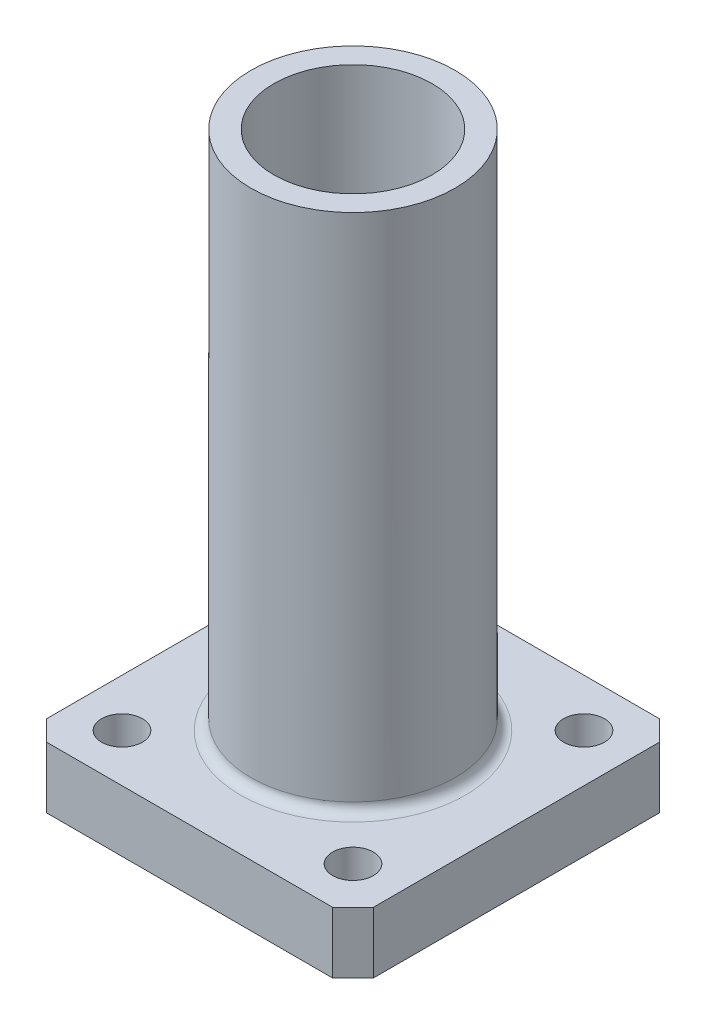
ISO-10303-21;
HEADER;
FILE_DESCRIPTION(('STEP AP214'),'2;1');
FILE_NAME('part.step','',(''),(''),'','','');
FILE_SCHEMA(('AUTOMOTIVE_DESIGN { 1 0 10303 214 1 1 1 1 }'));
ENDSEC;
DATA;
#1=APPLICATION_CONTEXT('core data for automotive mechanical design processes');
#2=APPLICATION_PROTOCOL_DEFINITION('international standard','automotive_design',2000,#1);
#3=PRODUCT_CONTEXT('',#1,'mechanical');
#4=PRODUCT('Part','Part','',(#3));
#5=PRODUCT_RELATED_PRODUCT_CATEGORY('part','',(#4));
#6=PRODUCT_DEFINITION_FORMATION('','',#4);
#7=PRODUCT_DEFINITION_CONTEXT('part definition',#1,'design');
#8=PRODUCT_DEFINITION('design','',#6,#7);
#9=PRODUCT_DEFINITION_SHAPE('','',#8);
#10=(LENGTH_UNIT() NAMED_UNIT(*) SI_UNIT(.MILLI.,.METRE.));
#11=(NAMED_UNIT(*) PLANE_ANGLE_UNIT() SI_UNIT($,.RADIAN.));
#12=(NAMED_UNIT(*) SI_UNIT($,.STERADIAN.) SOLID_ANGLE_UNIT());
#13=UNCERTAINTY_MEASURE_WITH_UNIT(LENGTH_MEASURE(1.E-05),#10,'distance_accuracy_value','');
#14=(GEOMETRIC_REPRESENTATION_CONTEXT(3) GLOBAL_UNCERTAINTY_ASSIGNED_CONTEXT((#13)) GLOBAL_UNIT_ASSIGNED_CONTEXT((#10,
#11,#12)) REPRESENTATION_CONTEXT('',''));
#15=CARTESIAN_POINT('',(0.,0.,0.));
#16=DIRECTION('',(0.,0.,1.));
#17=DIRECTION('',(1.,0.,0.));
#18=AXIS2_PLACEMENT_3D('',#15,#16,#17);
#19=CARTESIAN_POINT('',(0.,6.,0.));
#20=DIRECTION('',(0.,-1.,0.));
#21=DIRECTION('',(0.,0.,-1.));
#22=AXIS2_PLACEMENT_3D('',#19,#20,#21);
#23=PLANE('',#22);
#24=CARTESIAN_POINT('',(-0.274775851491413,6.,0.598857790802886));
#25=DIRECTION('',(0.,-1.,0.));
#26=DIRECTION('',(0.,0.,-1.));
#27=AXIS2_PLACEMENT_3D('',#24,#25,#26);
#28=CIRCLE('',#27,11.);
#29=CARTESIAN_POINT('',(-0.274775851491413,6.,-10.4011422091971));
#30=VERTEX_POINT('',#29);
#31=EDGE_CURVE('E11',#30,#30,#28,.T.);
#32=ORIENTED_EDGE('',*,*,#31,.T.);
#33=EDGE_LOOP('',(#32));
#34=FACE_BOUND('',#33,.T.);
#35=CARTESIAN_POINT('',(-11.5884843504762,6.,11.9125662897877));
#36=DIRECTION('',(0.,1.,0.));
#37=DIRECTION('',(0.,0.,1.));
#38=AXIS2_PLACEMENT_3D('',#35,#36,#37);
#39=CIRCLE('',#38,2.);
#40=CARTESIAN_POINT('',(-11.5884843504762,6.,13.9125662897877));
#41=VERTEX_POINT('',#40);
#42=EDGE_CURVE('E242',#41,#41,#39,.T.);
#43=ORIENTED_EDGE('',*,*,#42,.F.);
#44=EDGE_LOOP('',(#43));
#45=FACE_BOUND('',#44,.T.);
#46=CARTESIAN_POINT('',(11.0389326474933,6.,-10.7148507081819));
#47=DIRECTION('',(0.,1.,0.));
#48=DIRECTION('',(0.,0.,1.));
#49=AXIS2_PLACEMENT_3D('',#46,#47,#48);
#50=CIRCLE('',#49,2.);
#51=CARTESIAN_POINT('',(11.0389326474933,6.,-8.71485070818187));
#52=VERTEX_POINT('',#51);
#53=EDGE_CURVE('E135',#52,#52,#50,.T.);
#54=ORIENTED_EDGE('',*,*,#53,.F.);
#55=EDGE_LOOP('',(#54));
#56=FACE_BOUND('',#55,.T.);
#57=DIRECTION('',(-1.,0.,0.));
#58=VECTOR('',#57,1.);
#59=CARTESIAN_POINT('',(-14.2747758514914,6.,-15.4011422091971));
#60=LINE('',#59,#58);
#61=CARTESIAN_POINT('',(13.7252241485086,6.,-15.4011422091971));
#62=VERTEX_POINT('',#61);
#63=CARTESIAN_POINT('',(-14.2747758514914,6.,-15.4011422091971));
#64=VERTEX_POINT('',#63);
#65=EDGE_CURVE('E146',#62,#64,#60,.T.);
#66=ORIENTED_EDGE('',*,*,#65,.T.);
#67=DIRECTION('',(-0.707106781186548,0.,0.707106781186548));
#68=VECTOR('',#67,1.);
#69=CARTESIAN_POINT('',(-16.2747758514914,6.,-13.4011422091971));
#70=LINE('',#69,#68);
#71=CARTESIAN_POINT('',(-16.2747758514914,6.,-13.4011422091971));
#72=VERTEX_POINT('',#71);
#73=EDGE_CURVE('E94',#64,#72,#70,.T.);
#74=ORIENTED_EDGE('',*,*,#73,.T.);
#75=DIRECTION('',(0.,0.,1.));
#76=VECTOR('',#75,1.);
#77=CARTESIAN_POINT('',(-16.2747758514914,6.,-13.4011422091971));
#78=LINE('',#77,#76);
#79=CARTESIAN_POINT('',(-16.2747758514914,6.,14.5988577908029));
#80=VERTEX_POINT('',#79);
#81=EDGE_CURVE('E225',#72,#80,#78,.T.);
#82=ORIENTED_EDGE('',*,*,#81,.T.);
#83=DIRECTION('',(0.707106781186548,0.,0.707106781186548));
#84=VECTOR('',#83,1.);
#85=CARTESIAN_POINT('',(-16.2747758514914,6.,14.5988577908029));
#86=LINE('',#85,#84);
#87=CARTESIAN_POINT('',(-14.2747758514914,6.,16.5988577908029));
#88=VERTEX_POINT('',#87);
#89=EDGE_CURVE('E227',#80,#88,#86,.T.);
#90=ORIENTED_EDGE('',*,*,#89,.T.);
#91=DIRECTION('',(1.,0.,0.));
#92=VECTOR('',#91,1.);
#93=CARTESIAN_POINT('',(-14.2747758514914,6.,16.5988577908029));
#94=LINE('',#93,#92);
#95=CARTESIAN_POINT('',(13.7252241485086,6.,16.5988577908029));
#96=VERTEX_POINT('',#95);
#97=EDGE_CURVE('E113',#88,#96,#94,.T.);
#98=ORIENTED_EDGE('',*,*,#97,.T.);
#99=DIRECTION('',(0.707106781186548,0.,-0.707106781186548));
#100=VECTOR('',#99,1.);
#101=CARTESIAN_POINT('',(13.7252241485086,6.,16.5988577908029));
#102=LINE('',#101,#100);
#103=CARTESIAN_POINT('',(15.7252241485086,6.,14.5988577908029));
#104=VERTEX_POINT('',#103);
#105=EDGE_CURVE('E107',#96,#104,#102,.T.);
#106=ORIENTED_EDGE('',*,*,#105,.T.);
#107=DIRECTION('',(0.,0.,-1.));
#108=VECTOR('',#107,1.);
#109=CARTESIAN_POINT('',(15.7252241485086,6.,-13.4011422091971));
#110=LINE('',#109,#108);
#111=CARTESIAN_POINT('',(15.7252241485086,6.,-13.4011422091971));
#112=VERTEX_POINT('',#111);
#113=EDGE_CURVE('E111',#104,#112,#110,.T.);
#114=ORIENTED_EDGE('',*,*,#113,.T.);
#115=DIRECTION('',(-0.707106781186548,0.,-0.707106781186548));
#116=VECTOR('',#115,1.);
#117=CARTESIAN_POINT('',(13.7252241485086,6.,-15.4011422091971));
#118=LINE('',#117,#116);
#119=EDGE_CURVE('E50',#112,#62,#118,.T.);
#120=ORIENTED_EDGE('',*,*,#119,.T.);
#121=EDGE_LOOP('',(#66,#74,#82,#90,#98,#106,#114,#120));
#122=FACE_BOUND('',#121,.T.);
#123=CARTESIAN_POINT('',(-11.5884843504762,6.,-10.7148507081819));
#124=DIRECTION('',(0.,1.,0.));
#125=DIRECTION('',(0.,0.,1.));
#126=AXIS2_PLACEMENT_3D('',#123,#124,#125);
#127=CIRCLE('',#126,2.);
#128=CARTESIAN_POINT('',(-11.5884843504762,6.,-8.71485070818187));
#129=VERTEX_POINT('',#128);
#130=EDGE_CURVE('E236',#129,#129,#127,.T.);
#131=ORIENTED_EDGE('',*,*,#130,.F.);
#132=EDGE_LOOP('',(#131));
#133=FACE_BOUND('',#132,.T.);
#134=CARTESIAN_POINT('',(11.0389326474933,6.,11.9125662897876));
#135=DIRECTION('',(0.,1.,0.));
#136=DIRECTION('',(0.,0.,1.));
#137=AXIS2_PLACEMENT_3D('',#134,#135,#136);
#138=CIRCLE('',#137,2.);
#139=CARTESIAN_POINT('',(11.0389326474933,6.,13.9125662897876));
#140=VERTEX_POINT('',#139);
#141=EDGE_CURVE('E248',#140,#140,#138,.T.);
#142=ORIENTED_EDGE('',*,*,#141,.F.);
#143=EDGE_LOOP('',(#142));
#144=FACE_BOUND('',#143,.T.);
#145=ADVANCED_FACE('F33',(#34,#45,#56,#122,#133,#144),#23,.F.);
#146=CARTESIAN_POINT('',(0.,0.,0.));
#147=DIRECTION('',(0.,-1.,0.));
#148=DIRECTION('',(0.,0.,-1.));
#149=AXIS2_PLACEMENT_3D('',#146,#147,#148);
#150=PLANE('',#149);
#151=CARTESIAN_POINT('',(-0.274775851491413,0.,0.59885779080289));
#152=DIRECTION('',(0.,1.,0.));
#153=DIRECTION('',(0.,0.,1.));
#154=AXIS2_PLACEMENT_3D('',#151,#152,#153);
#155=CIRCLE('',#154,7.75);
#156=CARTESIAN_POINT('',(-0.274775851491413,0.,8.34885779080289));
#157=VERTEX_POINT('',#156);
#158=EDGE_CURVE('E259',#157,#157,#155,.T.);
#159=ORIENTED_EDGE('',*,*,#158,.T.);
#160=EDGE_LOOP('',(#159));
#161=FACE_BOUND('',#160,.T.);
#162=CARTESIAN_POINT('',(-11.5884843504762,0.,11.9125662897877));
#163=DIRECTION('',(0.,1.,0.));
#164=DIRECTION('',(0.,0.,1.));
#165=AXIS2_PLACEMENT_3D('',#162,#163,#164);
#166=CIRCLE('',#165,2.);
#167=CARTESIAN_POINT('',(-11.5884843504762,0.,13.9125662897877));
#168=VERTEX_POINT('',#167);
#169=EDGE_CURVE('E245',#168,#168,#166,.T.);
#170=ORIENTED_EDGE('',*,*,#169,.T.);
#171=EDGE_LOOP('',(#170));
#172=FACE_BOUND('',#171,.T.);
#173=CARTESIAN_POINT('',(11.0389326474933,0.,-10.7148507081819));
#174=DIRECTION('',(0.,1.,0.));
#175=DIRECTION('',(0.,0.,1.));
#176=AXIS2_PLACEMENT_3D('',#173,#174,#175);
#177=CIRCLE('',#176,2.);
#178=CARTESIAN_POINT('',(11.0389326474933,0.,-8.71485070818187));
#179=VERTEX_POINT('',#178);
#180=EDGE_CURVE('E233',#179,#179,#177,.T.);
#181=ORIENTED_EDGE('',*,*,#180,.T.);
#182=EDGE_LOOP('',(#181));
#183=FACE_BOUND('',#182,.T.);
#184=DIRECTION('',(-1.,0.,0.));
#185=VECTOR('',#184,1.);
#186=CARTESIAN_POINT('',(-14.2747758514914,0.,-15.4011422091971));
#187=LINE('',#186,#185);
#188=CARTESIAN_POINT('',(13.7252241485086,0.,-15.4011422091971));
#189=VERTEX_POINT('',#188);
#190=CARTESIAN_POINT('',(-14.2747758514914,0.,-15.4011422091971));
#191=VERTEX_POINT('',#190);
#192=EDGE_CURVE('E131',#189,#191,#187,.T.);
#193=ORIENTED_EDGE('',*,*,#192,.F.);
#194=DIRECTION('',(-0.707106781186548,0.,-0.707106781186548));
#195=VECTOR('',#194,1.);
#196=CARTESIAN_POINT('',(13.7252241485086,0.,-15.4011422091971));
#197=LINE('',#196,#195);
#198=CARTESIAN_POINT('',(15.7252241485086,0.,-13.4011422091971));
#199=VERTEX_POINT('',#198);
#200=EDGE_CURVE('E85',#199,#189,#197,.T.);
#201=ORIENTED_EDGE('',*,*,#200,.F.);
#202=DIRECTION('',(0.,0.,-1.));
#203=VECTOR('',#202,1.);
#204=CARTESIAN_POINT('',(15.7252241485086,0.,-13.4011422091971));
#205=LINE('',#204,#203);
#206=CARTESIAN_POINT('',(15.7252241485086,0.,14.5988577908029));
#207=VERTEX_POINT('',#206);
#208=EDGE_CURVE('E79',#207,#199,#205,.T.);
#209=ORIENTED_EDGE('',*,*,#208,.F.);
#210=DIRECTION('',(0.707106781186548,0.,-0.707106781186548));
#211=VECTOR('',#210,1.);
#212=CARTESIAN_POINT('',(13.7252241485086,0.,16.5988577908029));
#213=LINE('',#212,#211);
#214=CARTESIAN_POINT('',(13.7252241485086,0.,16.5988577908029));
#215=VERTEX_POINT('',#214);
#216=EDGE_CURVE('E121',#215,#207,#213,.T.);
#217=ORIENTED_EDGE('',*,*,#216,.F.);
#218=DIRECTION('',(1.,0.,0.));
#219=VECTOR('',#218,1.);
#220=CARTESIAN_POINT('',(-14.2747758514914,0.,16.5988577908029));
#221=LINE('',#220,#219);
#222=CARTESIAN_POINT('',(-14.2747758514914,0.,16.5988577908029));
#223=VERTEX_POINT('',#222);
#224=EDGE_CURVE('E141',#223,#215,#221,.T.);
#225=ORIENTED_EDGE('',*,*,#224,.F.);
#226=DIRECTION('',(0.707106781186548,0.,0.707106781186548));
#227=VECTOR('',#226,1.);
#228=CARTESIAN_POINT('',(-16.2747758514914,0.,14.5988577908029));
#229=LINE('',#228,#227);
#230=CARTESIAN_POINT('',(-16.2747758514914,0.,14.5988577908029));
#231=VERTEX_POINT('',#230);
#232=EDGE_CURVE('E139',#231,#223,#229,.T.);
#233=ORIENTED_EDGE('',*,*,#232,.F.);
#234=DIRECTION('',(0.,0.,1.));
#235=VECTOR('',#234,1.);
#236=CARTESIAN_POINT('',(-16.2747758514914,0.,-13.4011422091971));
#237=LINE('',#236,#235);
#238=CARTESIAN_POINT('',(-16.2747758514914,0.,-13.4011422091971));
#239=VERTEX_POINT('',#238);
#240=EDGE_CURVE('E137',#239,#231,#237,.T.);
#241=ORIENTED_EDGE('',*,*,#240,.F.);
#242=DIRECTION('',(-0.707106781186548,0.,0.707106781186548));
#243=VECTOR('',#242,1.);
#244=CARTESIAN_POINT('',(-16.2747758514914,0.,-13.4011422091971));
#245=LINE('',#244,#243);
#246=EDGE_CURVE('E134',#191,#239,#245,.T.);
#247=ORIENTED_EDGE('',*,*,#246,.F.);
#248=EDGE_LOOP('',(#193,#201,#209,#217,#225,#233,#241,#247));
#249=FACE_BOUND('',#248,.T.);
#250=CARTESIAN_POINT('',(-11.5884843504762,0.,-10.7148507081819));
#251=DIRECTION('',(0.,1.,0.));
#252=DIRECTION('',(0.,0.,1.));
#253=AXIS2_PLACEMENT_3D('',#250,#251,#252);
#254=CIRCLE('',#253,2.);
#255=CARTESIAN_POINT('',(-11.5884843504762,0.,-8.71485070818187));
#256=VERTEX_POINT('',#255);
#257=EDGE_CURVE('E239',#256,#256,#254,.T.);
#258=ORIENTED_EDGE('',*,*,#257,.T.);
#259=EDGE_LOOP('',(#258));
#260=FACE_BOUND('',#259,.T.);
#261=CARTESIAN_POINT('',(11.0389326474933,0.,11.9125662897876));
#262=DIRECTION('',(0.,1.,0.));
#263=DIRECTION('',(0.,0.,1.));
#264=AXIS2_PLACEMENT_3D('',#261,#262,#263);
#265=CIRCLE('',#264,2.);
#266=CARTESIAN_POINT('',(11.0389326474933,0.,13.9125662897876));
#267=VERTEX_POINT('',#266);
#268=EDGE_CURVE('E251',#267,#267,#265,.T.);
#269=ORIENTED_EDGE('',*,*,#268,.T.);
#270=EDGE_LOOP('',(#269));
#271=FACE_BOUND('',#270,.T.);
#272=ADVANCED_FACE('F177',(#161,#172,#183,#249,#260,#271),#150,.T.);
#273=CARTESIAN_POINT('',(-14.2747758514914,6.,-15.4011422091971));
#274=DIRECTION('',(0.,0.,1.));
#275=DIRECTION('',(1.,0.,0.));
#276=AXIS2_PLACEMENT_3D('',#273,#274,#275);
#277=PLANE('',#276);
#278=ORIENTED_EDGE('',*,*,#192,.T.);
#279=DIRECTION('',(0.,-1.,0.));
#280=VECTOR('',#279,1.);
#281=CARTESIAN_POINT('',(-14.2747758514914,6.,-15.4011422091971));
#282=LINE('',#281,#280);
#283=EDGE_CURVE('E159',#64,#191,#282,.T.);
#284=ORIENTED_EDGE('',*,*,#283,.F.);
#285=ORIENTED_EDGE('',*,*,#65,.F.);
#286=DIRECTION('',(0.,-1.,0.));
#287=VECTOR('',#286,1.);
#288=CARTESIAN_POINT('',(13.7252241485086,6.,-15.4011422091971));
#289=LINE('',#288,#287);
#290=EDGE_CURVE('E127',#62,#189,#289,.T.);
#291=ORIENTED_EDGE('',*,*,#290,.T.);
#292=EDGE_LOOP('',(#278,#284,#285,#291));
#293=FACE_BOUND('',#292,.T.);
#294=ADVANCED_FACE('F183',(#293),#277,.F.);
#295=CARTESIAN_POINT('',(-16.2747758514914,6.,-13.4011422091971));
#296=DIRECTION('',(0.707106781186547,0.,0.707106781186547));
#297=DIRECTION('',(0.707106781186548,0.,-0.707106781186548));
#298=AXIS2_PLACEMENT_3D('',#295,#296,#297);
#299=PLANE('',#298);
#300=ORIENTED_EDGE('',*,*,#246,.T.);
#301=DIRECTION('',(0.,-1.,0.));
#302=VECTOR('',#301,1.);
#303=CARTESIAN_POINT('',(-16.2747758514914,6.,-13.4011422091971));
#304=LINE('',#303,#302);
#305=EDGE_CURVE('E156',#72,#239,#304,.T.);
#306=ORIENTED_EDGE('',*,*,#305,.F.);
#307=ORIENTED_EDGE('',*,*,#73,.F.);
#308=ORIENTED_EDGE('',*,*,#283,.T.);
#309=EDGE_LOOP('',(#300,#306,#307,#308));
#310=FACE_BOUND('',#309,.T.);
#311=ADVANCED_FACE('F209',(#310),#299,.F.);
#312=CARTESIAN_POINT('',(-16.2747758514914,6.,-13.4011422091971));
#313=DIRECTION('',(1.,0.,0.));
#314=DIRECTION('',(0.,0.,-1.));
#315=AXIS2_PLACEMENT_3D('',#312,#313,#314);
#316=PLANE('',#315);
#317=ORIENTED_EDGE('',*,*,#240,.T.);
#318=DIRECTION('',(0.,-1.,0.));
#319=VECTOR('',#318,1.);
#320=CARTESIAN_POINT('',(-16.2747758514914,6.,14.5988577908029));
#321=LINE('',#320,#319);
#322=EDGE_CURVE('E153',#80,#231,#321,.T.);
#323=ORIENTED_EDGE('',*,*,#322,.F.);
#324=ORIENTED_EDGE('',*,*,#81,.F.);
#325=ORIENTED_EDGE('',*,*,#305,.T.);
#326=EDGE_LOOP('',(#317,#323,#324,#325));
#327=FACE_BOUND('',#326,.T.);
#328=ADVANCED_FACE('F205',(#327),#316,.F.);
#329=CARTESIAN_POINT('',(-16.2747758514914,6.,14.5988577908029));
#330=DIRECTION('',(0.707106781186547,0.,-0.707106781186547));
#331=DIRECTION('',(-0.707106781186548,0.,-0.707106781186548));
#332=AXIS2_PLACEMENT_3D('',#329,#330,#331);
#333=PLANE('',#332);
#334=ORIENTED_EDGE('',*,*,#232,.T.);
#335=DIRECTION('',(0.,-1.,0.));
#336=VECTOR('',#335,1.);
#337=CARTESIAN_POINT('',(-14.2747758514914,6.,16.5988577908029));
#338=LINE('',#337,#336);
#339=EDGE_CURVE('E150',#88,#223,#338,.T.);
#340=ORIENTED_EDGE('',*,*,#339,.F.);
#341=ORIENTED_EDGE('',*,*,#89,.F.);
#342=ORIENTED_EDGE('',*,*,#322,.T.);
#343=EDGE_LOOP('',(#334,#340,#341,#342));
#344=FACE_BOUND('',#343,.T.);
#345=ADVANCED_FACE('F201',(#344),#333,.F.);
#346=CARTESIAN_POINT('',(-14.2747758514914,6.,16.5988577908029));
#347=DIRECTION('',(0.,0.,-1.));
#348=DIRECTION('',(-1.,0.,0.));
#349=AXIS2_PLACEMENT_3D('',#346,#347,#348);
#350=PLANE('',#349);
#351=ORIENTED_EDGE('',*,*,#224,.T.);
#352=DIRECTION('',(0.,-1.,0.));
#353=VECTOR('',#352,1.);
#354=CARTESIAN_POINT('',(13.7252241485086,6.,16.5988577908029));
#355=LINE('',#354,#353);
#356=EDGE_CURVE('E122',#96,#215,#355,.T.);
#357=ORIENTED_EDGE('',*,*,#356,.F.);
#358=ORIENTED_EDGE('',*,*,#97,.F.);
#359=ORIENTED_EDGE('',*,*,#339,.T.);
#360=EDGE_LOOP('',(#351,#357,#358,#359));
#361=FACE_BOUND('',#360,.T.);
#362=ADVANCED_FACE('F198',(#361),#350,.F.);
#363=CARTESIAN_POINT('',(13.7252241485086,6.,16.5988577908029));
#364=DIRECTION('',(-0.707106781186547,0.,-0.707106781186547));
#365=DIRECTION('',(-0.707106781186548,0.,0.707106781186548));
#366=AXIS2_PLACEMENT_3D('',#363,#364,#365);
#367=PLANE('',#366);
#368=ORIENTED_EDGE('',*,*,#216,.T.);
#369=DIRECTION('',(0.,-1.,0.));
#370=VECTOR('',#369,1.);
#371=CARTESIAN_POINT('',(15.7252241485086,6.,14.5988577908029));
#372=LINE('',#371,#370);
#373=EDGE_CURVE('E118',#104,#207,#372,.T.);
#374=ORIENTED_EDGE('',*,*,#373,.F.);
#375=ORIENTED_EDGE('',*,*,#105,.F.);
#376=ORIENTED_EDGE('',*,*,#356,.T.);
#377=EDGE_LOOP('',(#368,#374,#375,#376));
#378=FACE_BOUND('',#377,.T.);
#379=ADVANCED_FACE('F119',(#378),#367,.F.);
#380=CARTESIAN_POINT('',(15.7252241485086,6.,-13.4011422091971));
#381=DIRECTION('',(-1.,0.,0.));
#382=DIRECTION('',(0.,0.,1.));
#383=AXIS2_PLACEMENT_3D('',#380,#381,#382);
#384=PLANE('',#383);
#385=ORIENTED_EDGE('',*,*,#208,.T.);
#386=DIRECTION('',(0.,-1.,0.));
#387=VECTOR('',#386,1.);
#388=CARTESIAN_POINT('',(15.7252241485086,6.,-13.4011422091971));
#389=LINE('',#388,#387);
#390=EDGE_CURVE('E123',#112,#199,#389,.T.);
#391=ORIENTED_EDGE('',*,*,#390,.F.);
#392=ORIENTED_EDGE('',*,*,#113,.F.);
#393=ORIENTED_EDGE('',*,*,#373,.T.);
#394=EDGE_LOOP('',(#385,#391,#392,#393));
#395=FACE_BOUND('',#394,.T.);
#396=ADVANCED_FACE('F125',(#395),#384,.F.);
#397=CARTESIAN_POINT('',(13.7252241485086,6.,-15.4011422091971));
#398=DIRECTION('',(-0.707106781186547,0.,0.707106781186547));
#399=DIRECTION('',(0.707106781186548,0.,0.707106781186548));
#400=AXIS2_PLACEMENT_3D('',#397,#398,#399);
#401=PLANE('',#400);
#402=ORIENTED_EDGE('',*,*,#200,.T.);
#403=ORIENTED_EDGE('',*,*,#290,.F.);
#404=ORIENTED_EDGE('',*,*,#119,.F.);
#405=ORIENTED_EDGE('',*,*,#390,.T.);
#406=EDGE_LOOP('',(#402,#403,#404,#405));
#407=FACE_BOUND('',#406,.T.);
#408=ADVANCED_FACE('F191',(#407),#401,.F.);
#409=CARTESIAN_POINT('',(11.0389326474933,6.,-10.7148507081819));
#410=DIRECTION('',(0.,-1.,0.));
#411=DIRECTION('',(0.,0.,-1.));
#412=AXIS2_PLACEMENT_3D('',#409,#410,#411);
#413=CYLINDRICAL_SURFACE('',#412,2.);
#414=ORIENTED_EDGE('',*,*,#53,.T.);
#415=EDGE_LOOP('',(#414));
#416=FACE_BOUND('',#415,.T.);
#417=ORIENTED_EDGE('',*,*,#180,.F.);
#418=EDGE_LOOP('',(#417));
#419=FACE_BOUND('',#418,.T.);
#420=ADVANCED_FACE('F188',(#416,#419),#413,.F.);
#421=CARTESIAN_POINT('',(-11.5884843504762,6.,-10.7148507081819));
#422=DIRECTION('',(0.,-1.,0.));
#423=DIRECTION('',(0.,0.,-1.));
#424=AXIS2_PLACEMENT_3D('',#421,#422,#423);
#425=CYLINDRICAL_SURFACE('',#424,2.);
#426=ORIENTED_EDGE('',*,*,#130,.T.);
#427=EDGE_LOOP('',(#426));
#428=FACE_BOUND('',#427,.T.);
#429=ORIENTED_EDGE('',*,*,#257,.F.);
#430=EDGE_LOOP('',(#429));
#431=FACE_BOUND('',#430,.T.);
#432=ADVANCED_FACE('F284',(#428,#431),#425,.F.);
#433=CARTESIAN_POINT('',(-11.5884843504762,6.,11.9125662897877));
#434=DIRECTION('',(0.,-1.,0.));
#435=DIRECTION('',(0.,0.,-1.));
#436=AXIS2_PLACEMENT_3D('',#433,#434,#435);
#437=CYLINDRICAL_SURFACE('',#436,2.);
#438=ORIENTED_EDGE('',*,*,#42,.T.);
#439=EDGE_LOOP('',(#438));
#440=FACE_BOUND('',#439,.T.);
#441=ORIENTED_EDGE('',*,*,#169,.F.);
#442=EDGE_LOOP('',(#441));
#443=FACE_BOUND('',#442,.T.);
#444=ADVANCED_FACE('F279',(#440,#443),#437,.F.);
#445=CARTESIAN_POINT('',(11.0389326474933,6.,11.9125662897876));
#446=DIRECTION('',(0.,-1.,0.));
#447=DIRECTION('',(0.,0.,-1.));
#448=AXIS2_PLACEMENT_3D('',#445,#446,#447);
#449=CYLINDRICAL_SURFACE('',#448,2.);
#450=ORIENTED_EDGE('',*,*,#141,.T.);
#451=EDGE_LOOP('',(#450));
#452=FACE_BOUND('',#451,.T.);
#453=ORIENTED_EDGE('',*,*,#268,.F.);
#454=EDGE_LOOP('',(#453));
#455=FACE_BOUND('',#454,.T.);
#456=ADVANCED_FACE('F274',(#452,#455),#449,.F.);
#457=CARTESIAN_POINT('',(-0.274775851491413,57.,0.598857790802886));
#458=DIRECTION('',(0.,-1.,0.));
#459=DIRECTION('',(0.,0.,-1.));
#460=AXIS2_PLACEMENT_3D('',#457,#458,#459);
#461=CYLINDRICAL_SURFACE('',#460,10.);
#462=CARTESIAN_POINT('',(-0.274775851491413,7.,0.598857790802886));
#463=DIRECTION('',(0.,-1.,0.));
#464=DIRECTION('',(0.,0.,-1.));
#465=AXIS2_PLACEMENT_3D('',#462,#463,#464);
#466=CIRCLE('',#465,10.);
#467=CARTESIAN_POINT('',(-0.274775851491413,7.,-9.40114220919711));
#468=VERTEX_POINT('',#467);
#469=EDGE_CURVE('E42',#468,#468,#466,.F.);
#470=ORIENTED_EDGE('',*,*,#469,.T.);
#471=EDGE_LOOP('',(#470));
#472=FACE_BOUND('',#471,.T.);
#473=CARTESIAN_POINT('',(-0.274775851491413,57.,0.598857790802886));
#474=DIRECTION('',(0.,1.,0.));
#475=DIRECTION('',(0.,0.,1.));
#476=AXIS2_PLACEMENT_3D('',#473,#474,#475);
#477=CIRCLE('',#476,10.);
#478=CARTESIAN_POINT('',(-0.274775851491413,57.,10.5988577908029));
#479=VERTEX_POINT('',#478);
#480=EDGE_CURVE('E254',#479,#479,#477,.T.);
#481=ORIENTED_EDGE('',*,*,#480,.F.);
#482=EDGE_LOOP('',(#481));
#483=FACE_BOUND('',#482,.T.);
#484=ADVANCED_FACE('F163',(#472,#483),#461,.T.);
#485=CARTESIAN_POINT('',(-0.274775851491413,57.,0.598857790802886));
#486=DIRECTION('',(0.,1.,0.));
#487=DIRECTION('',(0.,0.,1.));
#488=AXIS2_PLACEMENT_3D('',#485,#486,#487);
#489=PLANE('',#488);
#490=CARTESIAN_POINT('',(-0.274775851491413,57.,0.59885779080289));
#491=DIRECTION('',(0.,1.,0.));
#492=DIRECTION('',(0.,0.,1.));
#493=AXIS2_PLACEMENT_3D('',#490,#491,#492);
#494=CIRCLE('',#493,7.75);
#495=CARTESIAN_POINT('',(-0.274775851491413,57.,8.34885779080289));
#496=VERTEX_POINT('',#495);
#497=EDGE_CURVE('E260',#496,#496,#494,.T.);
#498=ORIENTED_EDGE('',*,*,#497,.F.);
#499=EDGE_LOOP('',(#498));
#500=FACE_BOUND('',#499,.T.);
#501=ORIENTED_EDGE('',*,*,#480,.T.);
#502=EDGE_LOOP('',(#501));
#503=FACE_BOUND('',#502,.T.);
#504=ADVANCED_FACE('F172',(#500,#503),#489,.T.);
#505=CARTESIAN_POINT('',(-0.274775851491413,0.,0.59885779080289));
#506=DIRECTION('',(0.,1.,0.));
#507=DIRECTION('',(0.,0.,1.));
#508=AXIS2_PLACEMENT_3D('',#505,#506,#507);
#509=CYLINDRICAL_SURFACE('',#508,7.75);
#510=ORIENTED_EDGE('',*,*,#158,.F.);
#511=EDGE_LOOP('',(#510));
#512=FACE_BOUND('',#511,.T.);
#513=ORIENTED_EDGE('',*,*,#497,.T.);
#514=EDGE_LOOP('',(#513));
#515=FACE_BOUND('',#514,.T.);
#516=ADVANCED_FACE('F167',(#512,#515),#509,.F.);
#517=CARTESIAN_POINT('',(-0.274775851491413,7.,0.598857790802886));
#518=DIRECTION('',(0.,-1.,0.));
#519=DIRECTION('',(0.,0.,-1.));
#520=AXIS2_PLACEMENT_3D('',#517,#518,#519);
#521=TOROIDAL_SURFACE('',#520,11.,1.);
#522=ORIENTED_EDGE('',*,*,#31,.F.);
#523=EDGE_LOOP('',(#522));
#524=FACE_BOUND('',#523,.T.);
#525=ORIENTED_EDGE('',*,*,#469,.F.);
#526=EDGE_LOOP('',(#525));
#527=FACE_BOUND('',#526,.T.);
#528=ADVANCED_FACE('F35',(#524,#527),#521,.F.);
#529=CLOSED_SHELL('',(#145,#272,#294,#311,#328,#345,#362,#379,#396,#408,#420,#432,#444,#456,
#484,#504,#516,#528));
#530=MANIFOLD_SOLID_BREP('B2',#529);
#531=ADVANCED_BREP_SHAPE_REPRESENTATION('',(#18,#530),#14);
#532=SHAPE_DEFINITION_REPRESENTATION(#9,#531);
ENDSEC;
END-ISO-10303-21;
